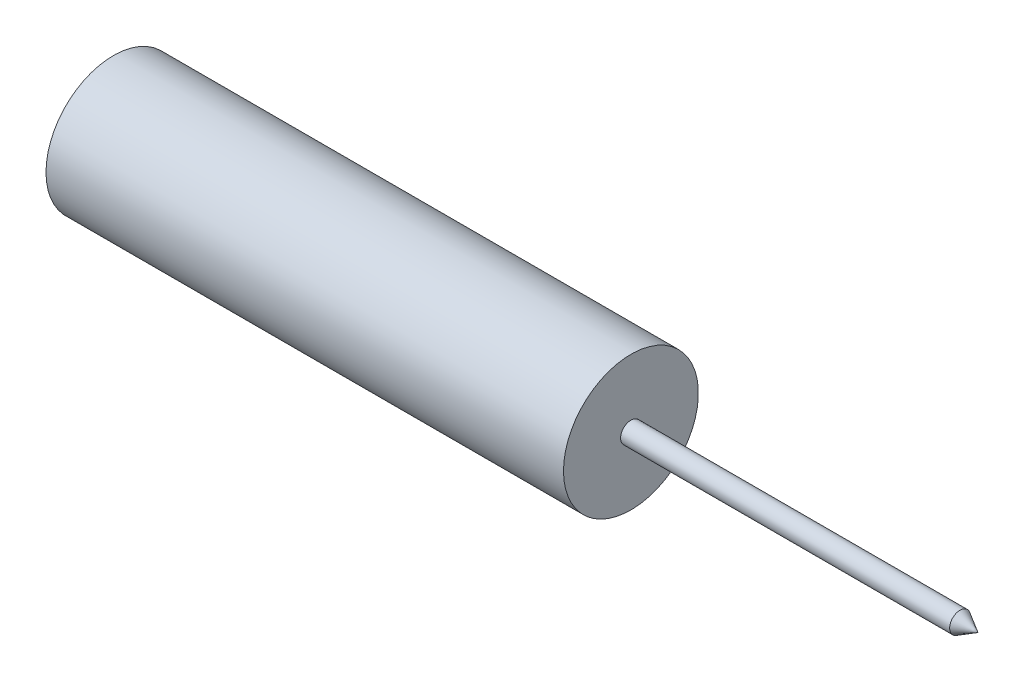
ISO-10303-21;
HEADER;
FILE_DESCRIPTION(('STEP AP214'),'2;1');
FILE_NAME('part.step','',(''),(''),'','','');
FILE_SCHEMA(('AUTOMOTIVE_DESIGN { 1 0 10303 214 1 1 1 1 }'));
ENDSEC;
DATA;
#1=APPLICATION_CONTEXT('core data for automotive mechanical design processes');
#2=APPLICATION_PROTOCOL_DEFINITION('international standard','automotive_design',2000,#1);
#3=PRODUCT_CONTEXT('',#1,'mechanical');
#4=PRODUCT('Part','Part','',(#3));
#5=PRODUCT_RELATED_PRODUCT_CATEGORY('part','',(#4));
#6=PRODUCT_DEFINITION_FORMATION('','',#4);
#7=PRODUCT_DEFINITION_CONTEXT('part definition',#1,'design');
#8=PRODUCT_DEFINITION('design','',#6,#7);
#9=PRODUCT_DEFINITION_SHAPE('','',#8);
#10=(LENGTH_UNIT() NAMED_UNIT(*) SI_UNIT(.MILLI.,.METRE.));
#11=(NAMED_UNIT(*) PLANE_ANGLE_UNIT() SI_UNIT($,.RADIAN.));
#12=(NAMED_UNIT(*) SI_UNIT($,.STERADIAN.) SOLID_ANGLE_UNIT());
#13=UNCERTAINTY_MEASURE_WITH_UNIT(LENGTH_MEASURE(1.E-05),#10,'distance_accuracy_value','');
#14=(GEOMETRIC_REPRESENTATION_CONTEXT(3) GLOBAL_UNCERTAINTY_ASSIGNED_CONTEXT((#13)) GLOBAL_UNIT_ASSIGNED_CONTEXT((#10,
#11,#12)) REPRESENTATION_CONTEXT('',''));
#15=CARTESIAN_POINT('',(0.,0.,0.));
#16=DIRECTION('',(0.,0.,1.));
#17=DIRECTION('',(1.,0.,0.));
#18=AXIS2_PLACEMENT_3D('',#15,#16,#17);
#19=CARTESIAN_POINT('',(0.,0.,-3.25));
#20=DIRECTION('',(1.,0.,0.));
#21=DIRECTION('',(0.,0.,-1.));
#22=AXIS2_PLACEMENT_3D('',#19,#20,#21);
#23=PLANE('',#22);
#24=CARTESIAN_POINT('',(0.,0.,0.));
#25=DIRECTION('',(-1.,0.,0.));
#26=DIRECTION('',(0.,0.,1.));
#27=AXIS2_PLACEMENT_3D('',#24,#25,#26);
#28=CIRCLE('',#27,3.25);
#29=CARTESIAN_POINT('',(0.,0.,3.25));
#30=VERTEX_POINT('',#29);
#31=EDGE_CURVE('E11',#30,#30,#28,.T.);
#32=ORIENTED_EDGE('',*,*,#31,.T.);
#33=EDGE_LOOP('',(#32));
#34=FACE_BOUND('',#33,.T.);
#35=ADVANCED_FACE('F33',(#34),#23,.F.);
#36=CARTESIAN_POINT('',(0.,0.,0.));
#37=DIRECTION('',(-1.,0.,0.));
#38=DIRECTION('',(0.,0.,1.));
#39=AXIS2_PLACEMENT_3D('',#36,#37,#38);
#40=CYLINDRICAL_SURFACE('',#39,3.25);
#41=ORIENTED_EDGE('',*,*,#31,.F.);
#42=EDGE_LOOP('',(#41));
#43=FACE_BOUND('',#42,.T.);
#44=CARTESIAN_POINT('',(24.9379994,0.,0.));
#45=DIRECTION('',(-1.,0.,0.));
#46=DIRECTION('',(0.,0.,1.));
#47=AXIS2_PLACEMENT_3D('',#44,#45,#46);
#48=CIRCLE('',#47,3.25);
#49=CARTESIAN_POINT('',(24.9379994,0.,3.25));
#50=VERTEX_POINT('',#49);
#51=EDGE_CURVE('E39',#50,#50,#48,.T.);
#52=ORIENTED_EDGE('',*,*,#51,.T.);
#53=EDGE_LOOP('',(#52));
#54=FACE_BOUND('',#53,.T.);
#55=ADVANCED_FACE('F55',(#43,#54),#40,.T.);
#56=CARTESIAN_POINT('',(24.9379994,0.,-3.25));
#57=DIRECTION('',(-1.,0.,0.));
#58=DIRECTION('',(0.,0.,1.));
#59=AXIS2_PLACEMENT_3D('',#56,#57,#58);
#60=PLANE('',#59);
#61=ORIENTED_EDGE('',*,*,#51,.F.);
#62=EDGE_LOOP('',(#61));
#63=FACE_BOUND('',#62,.T.);
#64=CARTESIAN_POINT('',(24.9379994,0.,0.));
#65=DIRECTION('',(-1.,0.,0.));
#66=DIRECTION('',(0.,0.,1.));
#67=AXIS2_PLACEMENT_3D('',#64,#65,#66);
#68=CIRCLE('',#67,0.499999999999999);
#69=CARTESIAN_POINT('',(24.9379994,0.,0.499999999999999));
#70=VERTEX_POINT('',#69);
#71=EDGE_CURVE('E66',#70,#70,#68,.T.);
#72=ORIENTED_EDGE('',*,*,#71,.T.);
#73=EDGE_LOOP('',(#72));
#74=FACE_BOUND('',#73,.T.);
#75=ADVANCED_FACE('F50',(#63,#74),#60,.F.);
#76=CARTESIAN_POINT('',(0.,0.,0.));
#77=DIRECTION('',(-1.,0.,0.));
#78=DIRECTION('',(0.,0.,1.));
#79=AXIS2_PLACEMENT_3D('',#76,#77,#78);
#80=CYLINDRICAL_SURFACE('',#79,0.499999999999999);
#81=ORIENTED_EDGE('',*,*,#71,.F.);
#82=EDGE_LOOP('',(#81));
#83=FACE_BOUND('',#82,.T.);
#84=CARTESIAN_POINT('',(40.7979994,0.,0.));
#85=DIRECTION('',(-1.,0.,0.));
#86=DIRECTION('',(0.,0.,1.));
#87=AXIS2_PLACEMENT_3D('',#84,#85,#86);
#88=CIRCLE('',#87,0.499999999999999);
#89=CARTESIAN_POINT('',(40.7979994,0.,0.499999999999999));
#90=VERTEX_POINT('',#89);
#91=EDGE_CURVE('E68',#90,#90,#88,.T.);
#92=ORIENTED_EDGE('',*,*,#91,.T.);
#93=EDGE_LOOP('',(#92));
#94=FACE_BOUND('',#93,.T.);
#95=ADVANCED_FACE('F44',(#83,#94),#80,.T.);
#96=CARTESIAN_POINT('',(41.6640248037844,0.,0.));
#97=DIRECTION('',(-1.,0.,0.));
#98=DIRECTION('',(0.,0.,1.));
#99=AXIS2_PLACEMENT_3D('',#96,#97,#98);
#100=CONICAL_SURFACE('',#99,0.,0.523598775598299);
#101=ORIENTED_EDGE('',*,*,#91,.F.);
#102=EDGE_LOOP('',(#101));
#103=FACE_BOUND('',#102,.T.);
#104=CARTESIAN_POINT('',(41.6640248037844,0.,0.));
#105=VERTEX_POINT('',#104);
#106=VERTEX_LOOP('',#105);
#107=FACE_BOUND('',#106,.T.);
#108=ADVANCED_FACE('F42',(#103,#107),#100,.T.);
#109=CLOSED_SHELL('',(#35,#55,#75,#95,#108));
#110=MANIFOLD_SOLID_BREP('B2',#109);
#111=ADVANCED_BREP_SHAPE_REPRESENTATION('',(#18,#110),#14);
#112=SHAPE_DEFINITION_REPRESENTATION(#9,#111);
ENDSEC;
END-ISO-10303-21;
